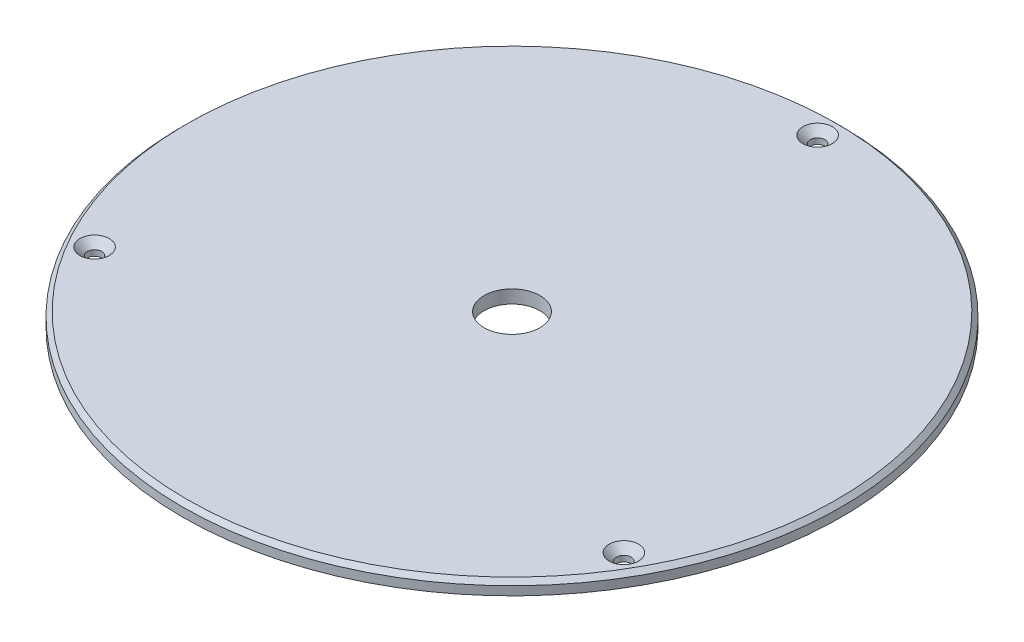
ISO-10303-21;
HEADER;
FILE_DESCRIPTION(('STEP AP214'),'2;1');
FILE_NAME('part.step','',(''),(''),'','','');
FILE_SCHEMA(('AUTOMOTIVE_DESIGN { 1 0 10303 214 1 1 1 1 }'));
ENDSEC;
DATA;
#1=APPLICATION_CONTEXT('core data for automotive mechanical design processes');
#2=APPLICATION_PROTOCOL_DEFINITION('international standard','automotive_design',2000,#1);
#3=PRODUCT_CONTEXT('',#1,'mechanical');
#4=PRODUCT('Part','Part','',(#3));
#5=PRODUCT_RELATED_PRODUCT_CATEGORY('part','',(#4));
#6=PRODUCT_DEFINITION_FORMATION('','',#4);
#7=PRODUCT_DEFINITION_CONTEXT('part definition',#1,'design');
#8=PRODUCT_DEFINITION('design','',#6,#7);
#9=PRODUCT_DEFINITION_SHAPE('','',#8);
#10=(LENGTH_UNIT() NAMED_UNIT(*) SI_UNIT(.MILLI.,.METRE.));
#11=(NAMED_UNIT(*) PLANE_ANGLE_UNIT() SI_UNIT($,.RADIAN.));
#12=(NAMED_UNIT(*) SI_UNIT($,.STERADIAN.) SOLID_ANGLE_UNIT());
#13=UNCERTAINTY_MEASURE_WITH_UNIT(LENGTH_MEASURE(1.E-05),#10,'distance_accuracy_value','');
#14=(GEOMETRIC_REPRESENTATION_CONTEXT(3) GLOBAL_UNCERTAINTY_ASSIGNED_CONTEXT((#13)) GLOBAL_UNIT_ASSIGNED_CONTEXT((#10,
#11,#12)) REPRESENTATION_CONTEXT('',''));
#15=CARTESIAN_POINT('',(0.,0.,0.));
#16=DIRECTION('',(0.,0.,1.));
#17=DIRECTION('',(1.,0.,0.));
#18=AXIS2_PLACEMENT_3D('',#15,#16,#17);
#19=CARTESIAN_POINT('',(0.,3.,0.));
#20=DIRECTION('',(0.,-1.,0.));
#21=DIRECTION('',(0.,0.,-1.));
#22=AXIS2_PLACEMENT_3D('',#19,#20,#21);
#23=CYLINDRICAL_SURFACE('',#22,75.);
#24=CARTESIAN_POINT('',(0.,2.00000000000003,0.));
#25=DIRECTION('',(0.,1.,0.));
#26=DIRECTION('',(0.,0.,1.));
#27=AXIS2_PLACEMENT_3D('',#24,#25,#26);
#28=CIRCLE('',#27,75.);
#29=CARTESIAN_POINT('',(0.,2.00000000000003,75.));
#30=VERTEX_POINT('',#29);
#31=EDGE_CURVE('E10',#30,#30,#28,.F.);
#32=ORIENTED_EDGE('',*,*,#31,.T.);
#33=EDGE_LOOP('',(#32));
#34=FACE_BOUND('',#33,.T.);
#35=CARTESIAN_POINT('',(0.,0.,0.));
#36=DIRECTION('',(0.,1.,0.));
#37=DIRECTION('',(0.,0.,1.));
#38=AXIS2_PLACEMENT_3D('',#35,#36,#37);
#39=CIRCLE('',#38,75.);
#40=CARTESIAN_POINT('',(0.,0.,75.));
#41=VERTEX_POINT('',#40);
#42=EDGE_CURVE('E66',#41,#41,#39,.T.);
#43=ORIENTED_EDGE('',*,*,#42,.T.);
#44=EDGE_LOOP('',(#43));
#45=FACE_BOUND('',#44,.T.);
#46=ADVANCED_FACE('F34',(#34,#45),#23,.T.);
#47=CARTESIAN_POINT('',(0.,3.,0.));
#48=DIRECTION('',(0.,1.,0.));
#49=DIRECTION('',(0.,0.,1.));
#50=AXIS2_PLACEMENT_3D('',#47,#48,#49);
#51=PLANE('',#50);
#52=CARTESIAN_POINT('',(0.,3.,0.));
#53=DIRECTION('',(0.,1.,0.));
#54=DIRECTION('',(0.,0.,1.));
#55=AXIS2_PLACEMENT_3D('',#52,#53,#54);
#56=CIRCLE('',#55,74.);
#57=CARTESIAN_POINT('',(0.,3.,74.));
#58=VERTEX_POINT('',#57);
#59=EDGE_CURVE('E41',#58,#58,#56,.T.);
#60=ORIENTED_EDGE('',*,*,#59,.T.);
#61=EDGE_LOOP('',(#60));
#62=FACE_BOUND('',#61,.T.);
#63=CARTESIAN_POINT('',(0.,3.,0.));
#64=DIRECTION('',(0.,1.,0.));
#65=DIRECTION('',(0.,0.,1.));
#66=AXIS2_PLACEMENT_3D('',#63,#64,#65);
#67=CIRCLE('',#66,6.35);
#68=CARTESIAN_POINT('',(0.,3.,6.34999999999999));
#69=VERTEX_POINT('',#68);
#70=EDGE_CURVE('E79',#69,#69,#67,.T.);
#71=ORIENTED_EDGE('',*,*,#70,.F.);
#72=EDGE_LOOP('',(#71));
#73=FACE_BOUND('',#72,.T.);
#74=CARTESIAN_POINT('',(60.232066833208,3.,34.7749999999994));
#75=DIRECTION('',(0.,1.,0.));
#76=DIRECTION('',(0.,0.,1.));
#77=AXIS2_PLACEMENT_3D('',#74,#75,#76);
#78=CIRCLE('',#77,3.35000000000002);
#79=CARTESIAN_POINT('',(60.232066833208,3.,38.1249999999995));
#80=VERTEX_POINT('',#79);
#81=EDGE_CURVE('E45',#80,#80,#78,.F.);
#82=ORIENTED_EDGE('',*,*,#81,.T.);
#83=EDGE_LOOP('',(#82));
#84=FACE_BOUND('',#83,.T.);
#85=CARTESIAN_POINT('',(-60.2320668332076,3.,34.7750000000003));
#86=DIRECTION('',(0.,1.,0.));
#87=DIRECTION('',(0.,0.,1.));
#88=AXIS2_PLACEMENT_3D('',#85,#86,#87);
#89=CIRCLE('',#88,3.34999999999999);
#90=CARTESIAN_POINT('',(-60.2320668332076,3.,38.1250000000003));
#91=VERTEX_POINT('',#90);
#92=EDGE_CURVE('E54',#91,#91,#89,.F.);
#93=ORIENTED_EDGE('',*,*,#92,.T.);
#94=EDGE_LOOP('',(#93));
#95=FACE_BOUND('',#94,.T.);
#96=CARTESIAN_POINT('',(0.,3.,-69.55));
#97=DIRECTION('',(0.,1.,0.));
#98=DIRECTION('',(0.,0.,1.));
#99=AXIS2_PLACEMENT_3D('',#96,#97,#98);
#100=CIRCLE('',#99,3.34999999999999);
#101=CARTESIAN_POINT('',(0.,3.,-66.2));
#102=VERTEX_POINT('',#101);
#103=EDGE_CURVE('E60',#102,#102,#100,.F.);
#104=ORIENTED_EDGE('',*,*,#103,.T.);
#105=EDGE_LOOP('',(#104));
#106=FACE_BOUND('',#105,.T.);
#107=ADVANCED_FACE('F95',(#62,#73,#84,#95,#106),#51,.T.);
#108=CARTESIAN_POINT('',(0.,0.,0.));
#109=DIRECTION('',(0.,1.,0.));
#110=DIRECTION('',(0.,0.,1.));
#111=AXIS2_PLACEMENT_3D('',#108,#109,#110);
#112=PLANE('',#111);
#113=CARTESIAN_POINT('',(0.,0.,0.));
#114=DIRECTION('',(0.,1.,0.));
#115=DIRECTION('',(0.,0.,1.));
#116=AXIS2_PLACEMENT_3D('',#113,#114,#115);
#117=CIRCLE('',#116,6.35);
#118=CARTESIAN_POINT('',(0.,0.,6.34999999999999));
#119=VERTEX_POINT('',#118);
#120=EDGE_CURVE('E76',#119,#119,#117,.T.);
#121=ORIENTED_EDGE('',*,*,#120,.T.);
#122=EDGE_LOOP('',(#121));
#123=FACE_BOUND('',#122,.T.);
#124=CARTESIAN_POINT('',(-60.2320668332076,0.,34.7750000000003));
#125=DIRECTION('',(0.,1.,0.));
#126=DIRECTION('',(0.866025403784436,0.,-0.500000000000004));
#127=AXIS2_PLACEMENT_3D('',#124,#125,#126);
#128=CIRCLE('',#127,1.65);
#129=CARTESIAN_POINT('',(-58.8031249169632,0.,33.9500000000003));
#130=VERTEX_POINT('',#129);
#131=EDGE_CURVE('E72',#130,#130,#128,.T.);
#132=ORIENTED_EDGE('',*,*,#131,.T.);
#133=EDGE_LOOP('',(#132));
#134=FACE_BOUND('',#133,.T.);
#135=CARTESIAN_POINT('',(60.232066833208,0.,34.7749999999994));
#136=DIRECTION('',(0.,1.,0.));
#137=DIRECTION('',(-0.866025403784443,0.,-0.499999999999992));
#138=AXIS2_PLACEMENT_3D('',#135,#136,#137);
#139=CIRCLE('',#138,1.65);
#140=CARTESIAN_POINT('',(58.8031249169637,0.,33.9499999999995));
#141=VERTEX_POINT('',#140);
#142=EDGE_CURVE('E73',#141,#141,#139,.T.);
#143=ORIENTED_EDGE('',*,*,#142,.T.);
#144=EDGE_LOOP('',(#143));
#145=FACE_BOUND('',#144,.T.);
#146=CARTESIAN_POINT('',(0.,0.,-69.55));
#147=DIRECTION('',(0.,1.,0.));
#148=DIRECTION('',(0.,0.,1.));
#149=AXIS2_PLACEMENT_3D('',#146,#147,#148);
#150=CIRCLE('',#149,1.65);
#151=CARTESIAN_POINT('',(0.,0.,-67.9));
#152=VERTEX_POINT('',#151);
#153=EDGE_CURVE('E69',#152,#152,#150,.T.);
#154=ORIENTED_EDGE('',*,*,#153,.T.);
#155=EDGE_LOOP('',(#154));
#156=FACE_BOUND('',#155,.T.);
#157=ORIENTED_EDGE('',*,*,#42,.F.);
#158=EDGE_LOOP('',(#157));
#159=FACE_BOUND('',#158,.T.);
#160=ADVANCED_FACE('F85',(#123,#134,#145,#156,#159),#112,.F.);
#161=CARTESIAN_POINT('',(0.,0.,-69.55));
#162=DIRECTION('',(0.,1.,0.));
#163=DIRECTION('',(0.,0.,1.));
#164=AXIS2_PLACEMENT_3D('',#161,#162,#163);
#165=CYLINDRICAL_SURFACE('',#164,1.65);
#166=CARTESIAN_POINT('',(0.,1.30000000000003,-69.55));
#167=DIRECTION('',(0.,1.,0.));
#168=DIRECTION('',(0.,0.,1.));
#169=AXIS2_PLACEMENT_3D('',#166,#167,#168);
#170=CIRCLE('',#169,1.65);
#171=CARTESIAN_POINT('',(0.,1.30000000000003,-67.9));
#172=VERTEX_POINT('',#171);
#173=EDGE_CURVE('E63',#172,#172,#170,.T.);
#174=ORIENTED_EDGE('',*,*,#173,.T.);
#175=EDGE_LOOP('',(#174));
#176=FACE_BOUND('',#175,.T.);
#177=ORIENTED_EDGE('',*,*,#153,.F.);
#178=EDGE_LOOP('',(#177));
#179=FACE_BOUND('',#178,.T.);
#180=ADVANCED_FACE('F109',(#176,#179),#165,.F.);
#181=CARTESIAN_POINT('',(0.,1.30000000000003,-69.55));
#182=DIRECTION('',(0.,1.,0.));
#183=DIRECTION('',(0.,0.,1.));
#184=AXIS2_PLACEMENT_3D('',#181,#182,#183);
#185=CONICAL_SURFACE('',#184,1.65,0.785398163397455);
#186=ORIENTED_EDGE('',*,*,#103,.F.);
#187=EDGE_LOOP('',(#186));
#188=FACE_BOUND('',#187,.T.);
#189=ORIENTED_EDGE('',*,*,#173,.F.);
#190=EDGE_LOOP('',(#189));
#191=FACE_BOUND('',#190,.T.);
#192=ADVANCED_FACE('F105',(#188,#191),#185,.F.);
#193=CARTESIAN_POINT('',(60.232066833208,0.,34.7749999999994));
#194=DIRECTION('',(0.,1.,0.));
#195=DIRECTION('',(0.,0.,1.));
#196=AXIS2_PLACEMENT_3D('',#193,#194,#195);
#197=CYLINDRICAL_SURFACE('',#196,1.65);
#198=CARTESIAN_POINT('',(60.232066833208,1.29999999999997,34.7749999999994));
#199=DIRECTION('',(0.,1.,0.));
#200=DIRECTION('',(0.,0.,1.));
#201=AXIS2_PLACEMENT_3D('',#198,#199,#200);
#202=CIRCLE('',#201,1.65);
#203=CARTESIAN_POINT('',(60.232066833208,1.29999999999997,36.4249999999994));
#204=VERTEX_POINT('',#203);
#205=EDGE_CURVE('E49',#204,#204,#202,.T.);
#206=ORIENTED_EDGE('',*,*,#205,.T.);
#207=EDGE_LOOP('',(#206));
#208=FACE_BOUND('',#207,.T.);
#209=ORIENTED_EDGE('',*,*,#142,.F.);
#210=EDGE_LOOP('',(#209));
#211=FACE_BOUND('',#210,.T.);
#212=ADVANCED_FACE('F108',(#208,#211),#197,.F.);
#213=CARTESIAN_POINT('',(-60.2320668332076,0.,34.7750000000003));
#214=DIRECTION('',(0.,1.,0.));
#215=DIRECTION('',(0.,0.,1.));
#216=AXIS2_PLACEMENT_3D('',#213,#214,#215);
#217=CYLINDRICAL_SURFACE('',#216,1.65);
#218=CARTESIAN_POINT('',(-60.2320668332076,1.30000000000003,34.7750000000003));
#219=DIRECTION('',(0.,1.,0.));
#220=DIRECTION('',(0.,0.,1.));
#221=AXIS2_PLACEMENT_3D('',#218,#219,#220);
#222=CIRCLE('',#221,1.65);
#223=CARTESIAN_POINT('',(-60.2320668332076,1.30000000000003,36.4250000000003));
#224=VERTEX_POINT('',#223);
#225=EDGE_CURVE('E57',#224,#224,#222,.T.);
#226=ORIENTED_EDGE('',*,*,#225,.T.);
#227=EDGE_LOOP('',(#226));
#228=FACE_BOUND('',#227,.T.);
#229=ORIENTED_EDGE('',*,*,#131,.F.);
#230=EDGE_LOOP('',(#229));
#231=FACE_BOUND('',#230,.T.);
#232=ADVANCED_FACE('F131',(#228,#231),#217,.F.);
#233=CARTESIAN_POINT('',(-60.2320668332076,1.30000000000003,34.7750000000003));
#234=DIRECTION('',(0.,1.,0.));
#235=DIRECTION('',(0.,0.,1.));
#236=AXIS2_PLACEMENT_3D('',#233,#234,#235);
#237=CONICAL_SURFACE('',#236,1.65,0.785398163397454);
#238=ORIENTED_EDGE('',*,*,#92,.F.);
#239=EDGE_LOOP('',(#238));
#240=FACE_BOUND('',#239,.T.);
#241=ORIENTED_EDGE('',*,*,#225,.F.);
#242=EDGE_LOOP('',(#241));
#243=FACE_BOUND('',#242,.T.);
#244=ADVANCED_FACE('F129',(#240,#243),#237,.F.);
#245=CARTESIAN_POINT('',(60.232066833208,1.29999999999997,34.7749999999994));
#246=DIRECTION('',(0.,1.,0.));
#247=DIRECTION('',(0.,0.,1.));
#248=AXIS2_PLACEMENT_3D('',#245,#246,#247);
#249=CONICAL_SURFACE('',#248,1.65,0.785398163397445);
#250=CARTESIAN_POINT('',(60.232066833208,3.,38.1249999999995));
#251=CARTESIAN_POINT('',(60.232066833208,2.98229166666667,38.1072916666661));
#252=CARTESIAN_POINT('',(60.232066833208,2.96458333333333,38.0895833333328));
#253=CARTESIAN_POINT('',(60.232066833208,2.92916666666667,38.0541666666661));
#254=CARTESIAN_POINT('',(60.232066833208,2.91145833333333,38.0364583333328));
#255=CARTESIAN_POINT('',(60.232066833208,2.87604166666666,38.0010416666661));
#256=CARTESIAN_POINT('',(60.232066833208,2.85833333333333,37.9833333333328));
#257=CARTESIAN_POINT('',(60.232066833208,2.82291666666666,37.9479166666661));
#258=CARTESIAN_POINT('',(60.232066833208,2.80520833333333,37.9302083333328));
#259=CARTESIAN_POINT('',(60.232066833208,2.76979166666666,37.8947916666661));
#260=CARTESIAN_POINT('',(60.232066833208,2.75208333333333,37.8770833333328));
#261=CARTESIAN_POINT('',(60.232066833208,2.71666666666666,37.8416666666661));
#262=CARTESIAN_POINT('',(60.232066833208,2.69895833333333,37.8239583333328));
#263=CARTESIAN_POINT('',(60.232066833208,2.66354166666666,37.7885416666661));
#264=CARTESIAN_POINT('',(60.232066833208,2.64583333333333,37.7708333333328));
#265=CARTESIAN_POINT('',(60.232066833208,2.61041666666666,37.7354166666661));
#266=CARTESIAN_POINT('',(60.232066833208,2.59270833333333,37.7177083333328));
#267=CARTESIAN_POINT('',(60.232066833208,2.55729166666666,37.6822916666661));
#268=CARTESIAN_POINT('',(60.232066833208,2.53958333333333,37.6645833333328));
#269=CARTESIAN_POINT('',(60.232066833208,2.50416666666666,37.6291666666661));
#270=CARTESIAN_POINT('',(60.232066833208,2.48645833333333,37.6114583333328));
#271=CARTESIAN_POINT('',(60.232066833208,2.45104166666666,37.5760416666661));
#272=CARTESIAN_POINT('',(60.232066833208,2.43333333333332,37.5583333333328));
#273=CARTESIAN_POINT('',(60.232066833208,2.39791666666666,37.5229166666661));
#274=CARTESIAN_POINT('',(60.232066833208,2.38020833333332,37.5052083333328));
#275=CARTESIAN_POINT('',(60.232066833208,2.34479166666666,37.4697916666661));
#276=CARTESIAN_POINT('',(60.232066833208,2.32708333333332,37.4520833333328));
#277=CARTESIAN_POINT('',(60.232066833208,2.29166666666666,37.4166666666661));
#278=CARTESIAN_POINT('',(60.232066833208,2.27395833333332,37.3989583333328));
#279=CARTESIAN_POINT('',(60.232066833208,2.23854166666665,37.3635416666661));
#280=CARTESIAN_POINT('',(60.232066833208,2.22083333333332,37.3458333333328));
#281=CARTESIAN_POINT('',(60.232066833208,2.18541666666665,37.3104166666661));
#282=CARTESIAN_POINT('',(60.232066833208,2.16770833333332,37.2927083333328));
#283=CARTESIAN_POINT('',(60.232066833208,2.13229166666665,37.2572916666661));
#284=CARTESIAN_POINT('',(60.232066833208,2.11458333333332,37.2395833333328));
#285=CARTESIAN_POINT('',(60.232066833208,2.07916666666665,37.2041666666661));
#286=CARTESIAN_POINT('',(60.232066833208,2.06145833333332,37.1864583333328));
#287=CARTESIAN_POINT('',(60.232066833208,2.02604166666665,37.1510416666661));
#288=CARTESIAN_POINT('',(60.232066833208,2.00833333333332,37.1333333333328));
#289=CARTESIAN_POINT('',(60.232066833208,1.97291666666665,37.0979166666661));
#290=CARTESIAN_POINT('',(60.232066833208,1.95520833333332,37.0802083333328));
#291=CARTESIAN_POINT('',(60.232066833208,1.91979166666665,37.0447916666661));
#292=CARTESIAN_POINT('',(60.232066833208,1.90208333333332,37.0270833333328));
#293=CARTESIAN_POINT('',(60.232066833208,1.86666666666665,36.9916666666661));
#294=CARTESIAN_POINT('',(60.232066833208,1.84895833333332,36.9739583333328));
#295=CARTESIAN_POINT('',(60.232066833208,1.81354166666665,36.9385416666661));
#296=CARTESIAN_POINT('',(60.232066833208,1.79583333333331,36.9208333333328));
#297=CARTESIAN_POINT('',(60.232066833208,1.76041666666665,36.8854166666661));
#298=CARTESIAN_POINT('',(60.232066833208,1.74270833333331,36.8677083333328));
#299=CARTESIAN_POINT('',(60.232066833208,1.70729166666665,36.8322916666661));
#300=CARTESIAN_POINT('',(60.232066833208,1.68958333333331,36.8145833333328));
#301=CARTESIAN_POINT('',(60.232066833208,1.65416666666665,36.7791666666661));
#302=CARTESIAN_POINT('',(60.232066833208,1.63645833333331,36.7614583333328));
#303=CARTESIAN_POINT('',(60.232066833208,1.60104166666665,36.7260416666661));
#304=CARTESIAN_POINT('',(60.232066833208,1.58333333333331,36.7083333333328));
#305=CARTESIAN_POINT('',(60.232066833208,1.54791666666664,36.6729166666661));
#306=CARTESIAN_POINT('',(60.232066833208,1.53020833333331,36.6552083333328));
#307=CARTESIAN_POINT('',(60.232066833208,1.49479166666664,36.6197916666661));
#308=CARTESIAN_POINT('',(60.232066833208,1.47708333333331,36.6020833333328));
#309=CARTESIAN_POINT('',(60.232066833208,1.44166666666664,36.5666666666661));
#310=CARTESIAN_POINT('',(60.232066833208,1.42395833333331,36.5489583333328));
#311=CARTESIAN_POINT('',(60.232066833208,1.38854166666664,36.5135416666661));
#312=CARTESIAN_POINT('',(60.232066833208,1.37083333333331,36.4958333333328));
#313=CARTESIAN_POINT('',(60.232066833208,1.33541666666664,36.4604166666661));
#314=CARTESIAN_POINT('',(60.232066833208,1.31770833333331,36.4427083333328));
#315=CARTESIAN_POINT('',(60.232066833208,1.29999999999997,36.4249999999994));
#316=B_SPLINE_CURVE_WITH_KNOTS('',3,(#250,#251,#252,#253,#254,#255,#256,#257,#258,#259,#260,
#261,#262,#263,#264,#265,#266,#267,#268,#269,#270,#271,#272,#273,#274,#275,#276,#277,#278,#279,
#280,#281,#282,#283,#284,#285,#286,#287,#288,#289,#290,#291,#292,#293,#294,#295,#296,#297,#298,
#299,#300,#301,#302,#303,#304,#305,#306,#307,#308,#309,#310,#311,#312,#313,#314,#315),
.UNSPECIFIED.,.F.,.F.,(4,2,2,2,2,2,2,2,2,2,2,2,2,2,2,2,2,2,2,2,2,2,2,2,2,2,2,2,2,2,2,2,4),(0.,
0.0751300955010722,0.150260191002144,0.225390286503216,0.300520382004288,0.37565047750536,
0.450780573006427,0.525910668507499,0.601040764008572,0.676170859509643,0.751300955010715,
0.826431050511787,0.901561146012859,0.976691241513931,1.051821337015,1.12695143251608,
1.20208152801714,1.27721162351821,1.35234171901929,1.42747181452036,1.50260191002143,
1.5777320055225,1.65286210102357,1.72799219652465,1.80312229202572,1.87825238752679,
1.95338248302786,2.02851257852893,2.10364267403,2.17877276953107,2.25390286503215,
2.32903296053322,2.40416305603429),.UNSPECIFIED.);
#317=EDGE_CURVE('BSEAM91',#80,#204,#316,.T.);
#318=ORIENTED_EDGE('',*,*,#81,.F.);
#319=ORIENTED_EDGE('',*,*,#205,.F.);
#320=ORIENTED_EDGE('',*,*,#317,.T.);
#321=ORIENTED_EDGE('',*,*,#317,.F.);
#322=EDGE_LOOP('',(#318,#320,#319,#321));
#323=FACE_BOUND('',#322,.T.);
#324=ADVANCED_FACE('F91',(#323),#249,.F.);
#325=CARTESIAN_POINT('',(0.,0.,0.));
#326=DIRECTION('',(0.,1.,0.));
#327=DIRECTION('',(0.,0.,1.));
#328=AXIS2_PLACEMENT_3D('',#325,#326,#327);
#329=CYLINDRICAL_SURFACE('',#328,6.35);
#330=ORIENTED_EDGE('',*,*,#120,.F.);
#331=EDGE_LOOP('',(#330));
#332=FACE_BOUND('',#331,.T.);
#333=ORIENTED_EDGE('',*,*,#70,.T.);
#334=EDGE_LOOP('',(#333));
#335=FACE_BOUND('',#334,.T.);
#336=ADVANCED_FACE('F88',(#332,#335),#329,.F.);
#337=CARTESIAN_POINT('',(0.,3.,0.));
#338=DIRECTION('',(0.,-1.,0.));
#339=DIRECTION('',(0.,0.,-1.));
#340=AXIS2_PLACEMENT_3D('',#337,#338,#339);
#341=CONICAL_SURFACE('',#340,74.,0.785398163397448);
#342=ORIENTED_EDGE('',*,*,#31,.F.);
#343=EDGE_LOOP('',(#342));
#344=FACE_BOUND('',#343,.T.);
#345=ORIENTED_EDGE('',*,*,#59,.F.);
#346=EDGE_LOOP('',(#345));
#347=FACE_BOUND('',#346,.T.);
#348=ADVANCED_FACE('F36',(#344,#347),#341,.T.);
#349=CLOSED_SHELL('',(#46,#107,#160,#180,#192,#212,#232,#244,#324,#336,#348));
#350=MANIFOLD_SOLID_BREP('B2',#349);
#351=ADVANCED_BREP_SHAPE_REPRESENTATION('',(#18,#350),#14);
#352=SHAPE_DEFINITION_REPRESENTATION(#9,#351);
ENDSEC;
END-ISO-10303-21;
